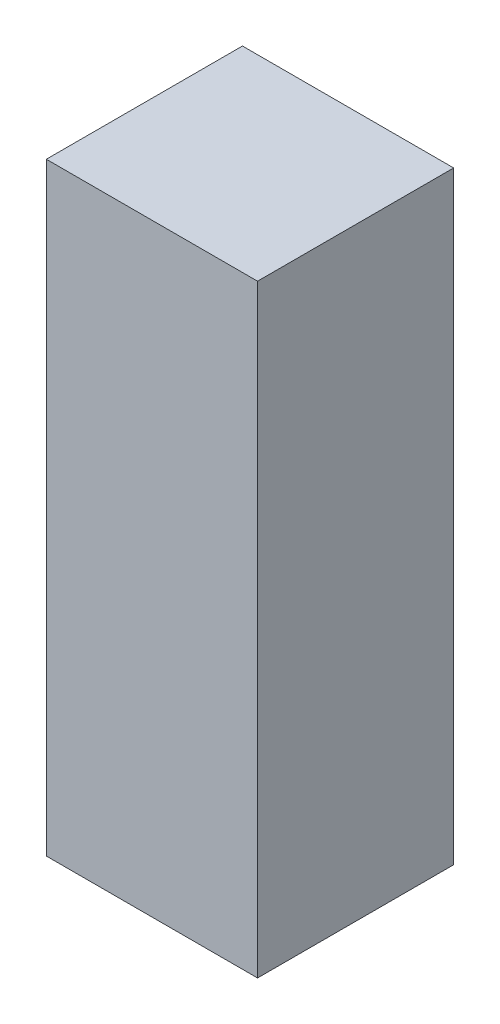
ISO-10303-21;
HEADER;
FILE_DESCRIPTION(('STEP AP214'),'2;1');
FILE_NAME('part.step','',(''),(''),'','','');
FILE_SCHEMA(('AUTOMOTIVE_DESIGN { 1 0 10303 214 1 1 1 1 }'));
ENDSEC;
DATA;
#1=APPLICATION_CONTEXT('core data for automotive mechanical design processes');
#2=APPLICATION_PROTOCOL_DEFINITION('international standard','automotive_design',2000,#1);
#3=PRODUCT_CONTEXT('',#1,'mechanical');
#4=PRODUCT('Part','Part','',(#3));
#5=PRODUCT_RELATED_PRODUCT_CATEGORY('part','',(#4));
#6=PRODUCT_DEFINITION_FORMATION('','',#4);
#7=PRODUCT_DEFINITION_CONTEXT('part definition',#1,'design');
#8=PRODUCT_DEFINITION('design','',#6,#7);
#9=PRODUCT_DEFINITION_SHAPE('','',#8);
#10=(LENGTH_UNIT() NAMED_UNIT(*) SI_UNIT(.MILLI.,.METRE.));
#11=(NAMED_UNIT(*) PLANE_ANGLE_UNIT() SI_UNIT($,.RADIAN.));
#12=(NAMED_UNIT(*) SI_UNIT($,.STERADIAN.) SOLID_ANGLE_UNIT());
#13=UNCERTAINTY_MEASURE_WITH_UNIT(LENGTH_MEASURE(1.E-05),#10,'distance_accuracy_value','');
#14=(GEOMETRIC_REPRESENTATION_CONTEXT(3) GLOBAL_UNCERTAINTY_ASSIGNED_CONTEXT((#13)) GLOBAL_UNIT_ASSIGNED_CONTEXT((#10,
#11,#12)) REPRESENTATION_CONTEXT('',''));
#15=CARTESIAN_POINT('',(0.,0.,0.));
#16=DIRECTION('',(0.,0.,1.));
#17=DIRECTION('',(1.,0.,0.));
#18=AXIS2_PLACEMENT_3D('',#15,#16,#17);
#19=CARTESIAN_POINT('',(24.,1380.,33.));
#20=DIRECTION('',(1.,0.,0.));
#21=DIRECTION('',(0.,0.,-1.));
#22=AXIS2_PLACEMENT_3D('',#19,#20,#21);
#23=PLANE('',#22);
#24=DIRECTION('',(0.,-1.,0.));
#25=VECTOR('',#24,1.);
#26=CARTESIAN_POINT('',(24.,1380.,20.));
#27=LINE('',#26,#25);
#28=CARTESIAN_POINT('',(24.,1420.,20.));
#29=VERTEX_POINT('',#28);
#30=CARTESIAN_POINT('',(24.,1380.,20.));
#31=VERTEX_POINT('',#30);
#32=EDGE_CURVE('E102',#29,#31,#27,.T.);
#33=ORIENTED_EDGE('',*,*,#32,.T.);
#34=DIRECTION('',(0.,0.,-1.));
#35=VECTOR('',#34,1.);
#36=CARTESIAN_POINT('',(24.,1380.,33.));
#37=LINE('',#36,#35);
#38=CARTESIAN_POINT('',(24.,1380.,33.));
#39=VERTEX_POINT('',#38);
#40=EDGE_CURVE('E11',#39,#31,#37,.T.);
#41=ORIENTED_EDGE('',*,*,#40,.F.);
#42=DIRECTION('',(0.,-1.,0.));
#43=VECTOR('',#42,1.);
#44=CARTESIAN_POINT('',(24.,1380.,33.));
#45=LINE('',#44,#43);
#46=CARTESIAN_POINT('',(24.,1420.,33.));
#47=VERTEX_POINT('',#46);
#48=EDGE_CURVE('E90',#47,#39,#45,.T.);
#49=ORIENTED_EDGE('',*,*,#48,.F.);
#50=DIRECTION('',(0.,0.,-1.));
#51=VECTOR('',#50,1.);
#52=CARTESIAN_POINT('',(24.,1420.,33.));
#53=LINE('',#52,#51);
#54=EDGE_CURVE('E98',#47,#29,#53,.T.);
#55=ORIENTED_EDGE('',*,*,#54,.T.);
#56=EDGE_LOOP('',(#33,#41,#49,#55));
#57=FACE_BOUND('',#56,.T.);
#58=ADVANCED_FACE('F39',(#57),#23,.F.);
#59=CARTESIAN_POINT('',(24.,1380.,33.));
#60=DIRECTION('',(0.,1.,0.));
#61=DIRECTION('',(0.,0.,1.));
#62=AXIS2_PLACEMENT_3D('',#59,#60,#61);
#63=PLANE('',#62);
#64=DIRECTION('',(1.,0.,0.));
#65=VECTOR('',#64,1.);
#66=CARTESIAN_POINT('',(24.,1380.,20.));
#67=LINE('',#66,#65);
#68=CARTESIAN_POINT('',(38.,1380.,20.));
#69=VERTEX_POINT('',#68);
#70=EDGE_CURVE('E94',#31,#69,#67,.T.);
#71=ORIENTED_EDGE('',*,*,#70,.T.);
#72=DIRECTION('',(0.,0.,-1.));
#73=VECTOR('',#72,1.);
#74=CARTESIAN_POINT('',(38.,1380.,33.));
#75=LINE('',#74,#73);
#76=CARTESIAN_POINT('',(38.,1380.,33.));
#77=VERTEX_POINT('',#76);
#78=EDGE_CURVE('E47',#77,#69,#75,.T.);
#79=ORIENTED_EDGE('',*,*,#78,.F.);
#80=DIRECTION('',(1.,0.,0.));
#81=VECTOR('',#80,1.);
#82=CARTESIAN_POINT('',(24.,1380.,33.));
#83=LINE('',#82,#81);
#84=EDGE_CURVE('E85',#39,#77,#83,.T.);
#85=ORIENTED_EDGE('',*,*,#84,.F.);
#86=ORIENTED_EDGE('',*,*,#40,.T.);
#87=EDGE_LOOP('',(#71,#79,#85,#86));
#88=FACE_BOUND('',#87,.T.);
#89=ADVANCED_FACE('F93',(#88),#63,.F.);
#90=CARTESIAN_POINT('',(38.,1380.,33.));
#91=DIRECTION('',(-1.,0.,0.));
#92=DIRECTION('',(0.,0.,1.));
#93=AXIS2_PLACEMENT_3D('',#90,#91,#92);
#94=PLANE('',#93);
#95=DIRECTION('',(0.,1.,0.));
#96=VECTOR('',#95,1.);
#97=CARTESIAN_POINT('',(38.,1380.,20.));
#98=LINE('',#97,#96);
#99=CARTESIAN_POINT('',(38.,1420.,20.));
#100=VERTEX_POINT('',#99);
#101=EDGE_CURVE('E72',#69,#100,#98,.T.);
#102=ORIENTED_EDGE('',*,*,#101,.T.);
#103=DIRECTION('',(0.,0.,-1.));
#104=VECTOR('',#103,1.);
#105=CARTESIAN_POINT('',(38.,1420.,33.));
#106=LINE('',#105,#104);
#107=CARTESIAN_POINT('',(38.,1420.,33.));
#108=VERTEX_POINT('',#107);
#109=EDGE_CURVE('E95',#108,#100,#106,.T.);
#110=ORIENTED_EDGE('',*,*,#109,.F.);
#111=DIRECTION('',(0.,1.,0.));
#112=VECTOR('',#111,1.);
#113=CARTESIAN_POINT('',(38.,1380.,33.));
#114=LINE('',#113,#112);
#115=EDGE_CURVE('E88',#77,#108,#114,.T.);
#116=ORIENTED_EDGE('',*,*,#115,.F.);
#117=ORIENTED_EDGE('',*,*,#78,.T.);
#118=EDGE_LOOP('',(#102,#110,#116,#117));
#119=FACE_BOUND('',#118,.T.);
#120=ADVANCED_FACE('F96',(#119),#94,.F.);
#121=CARTESIAN_POINT('',(24.,1420.,33.));
#122=DIRECTION('',(0.,-1.,0.));
#123=DIRECTION('',(0.,0.,-1.));
#124=AXIS2_PLACEMENT_3D('',#121,#122,#123);
#125=PLANE('',#124);
#126=DIRECTION('',(-1.,0.,0.));
#127=VECTOR('',#126,1.);
#128=CARTESIAN_POINT('',(24.,1420.,20.));
#129=LINE('',#128,#127);
#130=EDGE_CURVE('E78',#100,#29,#129,.T.);
#131=ORIENTED_EDGE('',*,*,#130,.T.);
#132=ORIENTED_EDGE('',*,*,#54,.F.);
#133=DIRECTION('',(-1.,0.,0.));
#134=VECTOR('',#133,1.);
#135=CARTESIAN_POINT('',(24.,1420.,33.));
#136=LINE('',#135,#134);
#137=EDGE_CURVE('E55',#108,#47,#136,.T.);
#138=ORIENTED_EDGE('',*,*,#137,.F.);
#139=ORIENTED_EDGE('',*,*,#109,.T.);
#140=EDGE_LOOP('',(#131,#132,#138,#139));
#141=FACE_BOUND('',#140,.T.);
#142=ADVANCED_FACE('F109',(#141),#125,.F.);
#143=CARTESIAN_POINT('',(0.,0.,33.));
#144=DIRECTION('',(0.,0.,-1.));
#145=DIRECTION('',(-1.,0.,0.));
#146=AXIS2_PLACEMENT_3D('',#143,#144,#145);
#147=PLANE('',#146);
#148=ORIENTED_EDGE('',*,*,#48,.T.);
#149=ORIENTED_EDGE('',*,*,#84,.T.);
#150=ORIENTED_EDGE('',*,*,#115,.T.);
#151=ORIENTED_EDGE('',*,*,#137,.T.);
#152=EDGE_LOOP('',(#148,#149,#150,#151));
#153=FACE_BOUND('',#152,.T.);
#154=ADVANCED_FACE('F86',(#153),#147,.F.);
#155=CARTESIAN_POINT('',(0.,0.,20.));
#156=DIRECTION('',(0.,0.,-1.));
#157=DIRECTION('',(-1.,0.,0.));
#158=AXIS2_PLACEMENT_3D('',#155,#156,#157);
#159=PLANE('',#158);
#160=ORIENTED_EDGE('',*,*,#32,.F.);
#161=ORIENTED_EDGE('',*,*,#130,.F.);
#162=ORIENTED_EDGE('',*,*,#101,.F.);
#163=ORIENTED_EDGE('',*,*,#70,.F.);
#164=EDGE_LOOP('',(#160,#161,#162,#163));
#165=FACE_BOUND('',#164,.T.);
#166=ADVANCED_FACE('F112',(#165),#159,.T.);
#167=CLOSED_SHELL('',(#58,#89,#120,#142,#154,#166));
#168=MANIFOLD_SOLID_BREP('B2',#167);
#169=ADVANCED_BREP_SHAPE_REPRESENTATION('',(#18,#168),#14);
#170=SHAPE_DEFINITION_REPRESENTATION(#9,#169);
ENDSEC;
END-ISO-10303-21;
